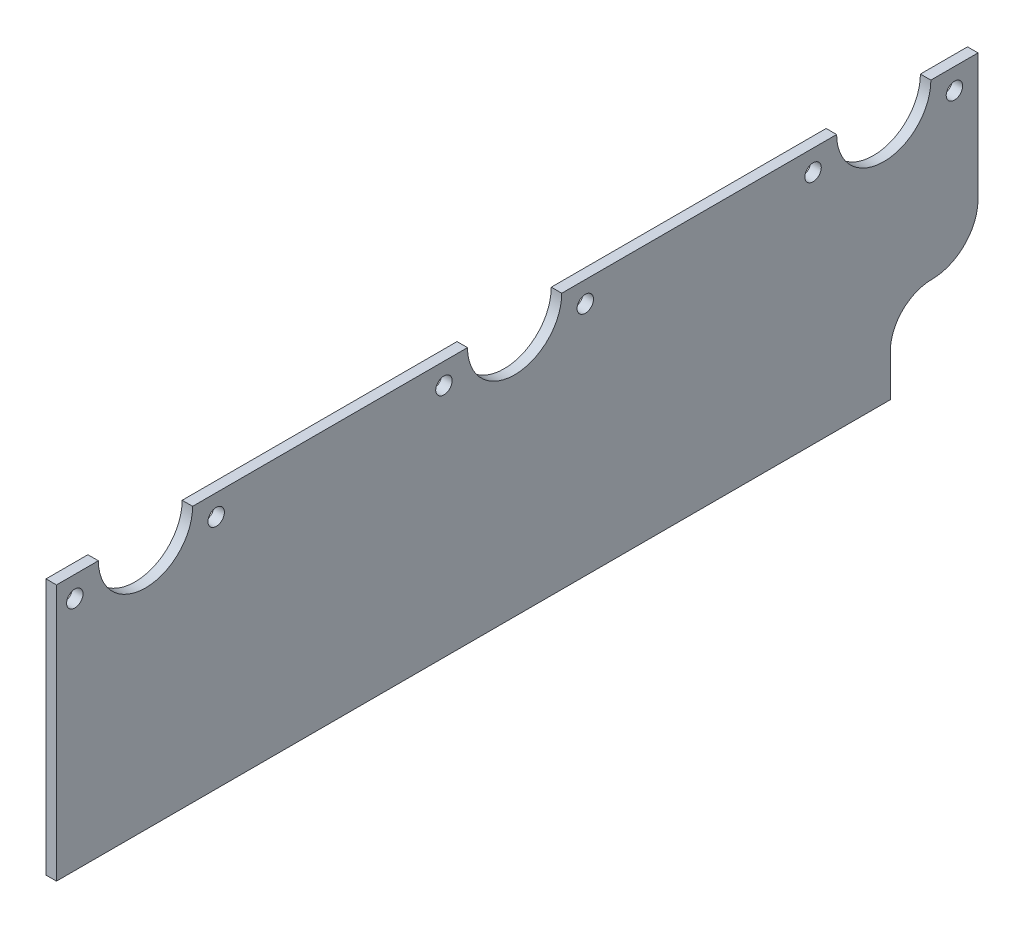
ISO-10303-21;
HEADER;
FILE_DESCRIPTION(('STEP AP214'),'2;1');
FILE_NAME('part.step','',(''),(''),'','','');
FILE_SCHEMA(('AUTOMOTIVE_DESIGN { 1 0 10303 214 1 1 1 1 }'));
ENDSEC;
DATA;
#1=APPLICATION_CONTEXT('core data for automotive mechanical design processes');
#2=APPLICATION_PROTOCOL_DEFINITION('international standard','automotive_design',2000,#1);
#3=PRODUCT_CONTEXT('',#1,'mechanical');
#4=PRODUCT('Part','Part','',(#3));
#5=PRODUCT_RELATED_PRODUCT_CATEGORY('part','',(#4));
#6=PRODUCT_DEFINITION_FORMATION('','',#4);
#7=PRODUCT_DEFINITION_CONTEXT('part definition',#1,'design');
#8=PRODUCT_DEFINITION('design','',#6,#7);
#9=PRODUCT_DEFINITION_SHAPE('','',#8);
#10=(LENGTH_UNIT() NAMED_UNIT(*) SI_UNIT(.MILLI.,.METRE.));
#11=(NAMED_UNIT(*) PLANE_ANGLE_UNIT() SI_UNIT($,.RADIAN.));
#12=(NAMED_UNIT(*) SI_UNIT($,.STERADIAN.) SOLID_ANGLE_UNIT());
#13=UNCERTAINTY_MEASURE_WITH_UNIT(LENGTH_MEASURE(1.E-05),#10,'distance_accuracy_value','');
#14=(GEOMETRIC_REPRESENTATION_CONTEXT(3) GLOBAL_UNCERTAINTY_ASSIGNED_CONTEXT((#13)) GLOBAL_UNIT_ASSIGNED_CONTEXT((#10,
#11,#12)) REPRESENTATION_CONTEXT('',''));
#15=CARTESIAN_POINT('',(0.,0.,0.));
#16=DIRECTION('',(0.,0.,1.));
#17=DIRECTION('',(1.,0.,0.));
#18=AXIS2_PLACEMENT_3D('',#15,#16,#17);
#19=CARTESIAN_POINT('',(3.175,0.,139.7));
#20=DIRECTION('',(0.,0.,-1.));
#21=DIRECTION('',(-1.,0.,0.));
#22=AXIS2_PLACEMENT_3D('',#19,#20,#21);
#23=PLANE('',#22);
#24=DIRECTION('',(0.,-1.,0.));
#25=VECTOR('',#24,1.);
#26=CARTESIAN_POINT('',(0.,0.,139.7));
#27=LINE('',#26,#25);
#28=CARTESIAN_POINT('',(0.,77.7875,139.7));
#29=VERTEX_POINT('',#28);
#30=CARTESIAN_POINT('',(0.,0.,139.7));
#31=VERTEX_POINT('',#30);
#32=EDGE_CURVE('E153',#29,#31,#27,.T.);
#33=ORIENTED_EDGE('',*,*,#32,.T.);
#34=DIRECTION('',(-1.,0.,0.));
#35=VECTOR('',#34,1.);
#36=CARTESIAN_POINT('',(3.175,0.,139.7));
#37=LINE('',#36,#35);
#38=CARTESIAN_POINT('',(3.175,0.,139.7));
#39=VERTEX_POINT('',#38);
#40=EDGE_CURVE('E11',#39,#31,#37,.T.);
#41=ORIENTED_EDGE('',*,*,#40,.F.);
#42=DIRECTION('',(0.,-1.,0.));
#43=VECTOR('',#42,1.);
#44=CARTESIAN_POINT('',(3.175,0.,139.7));
#45=LINE('',#44,#43);
#46=CARTESIAN_POINT('',(3.175,77.7875,139.7));
#47=VERTEX_POINT('',#46);
#48=EDGE_CURVE('E174',#47,#39,#45,.T.);
#49=ORIENTED_EDGE('',*,*,#48,.F.);
#50=DIRECTION('',(-1.,0.,0.));
#51=VECTOR('',#50,1.);
#52=CARTESIAN_POINT('',(3.175,77.7875,139.7));
#53=LINE('',#52,#51);
#54=EDGE_CURVE('E149',#47,#29,#53,.T.);
#55=ORIENTED_EDGE('',*,*,#54,.T.);
#56=EDGE_LOOP('',(#33,#41,#49,#55));
#57=FACE_BOUND('',#56,.T.);
#58=ADVANCED_FACE('F37',(#57),#23,.F.);
#59=CARTESIAN_POINT('',(3.175,0.,-139.7));
#60=DIRECTION('',(0.,1.,0.));
#61=DIRECTION('',(0.,0.,1.));
#62=AXIS2_PLACEMENT_3D('',#59,#60,#61);
#63=PLANE('',#62);
#64=DIRECTION('',(0.,0.,-1.));
#65=VECTOR('',#64,1.);
#66=CARTESIAN_POINT('',(0.,0.,-139.7));
#67=LINE('',#66,#65);
#68=CARTESIAN_POINT('',(0.,0.,-113.118899999999));
#69=VERTEX_POINT('',#68);
#70=EDGE_CURVE('E156',#31,#69,#67,.T.);
#71=ORIENTED_EDGE('',*,*,#70,.T.);
#72=DIRECTION('',(-1.,0.,0.));
#73=VECTOR('',#72,1.);
#74=CARTESIAN_POINT('',(3.175,0.,-113.118899999999));
#75=LINE('',#74,#73);
#76=CARTESIAN_POINT('',(3.175,0.,-113.118899999999));
#77=VERTEX_POINT('',#76);
#78=EDGE_CURVE('E51',#77,#69,#75,.T.);
#79=ORIENTED_EDGE('',*,*,#78,.F.);
#80=DIRECTION('',(0.,0.,-1.));
#81=VECTOR('',#80,1.);
#82=CARTESIAN_POINT('',(3.175,0.,-139.7));
#83=LINE('',#82,#81);
#84=EDGE_CURVE('E103',#39,#77,#83,.T.);
#85=ORIENTED_EDGE('',*,*,#84,.F.);
#86=ORIENTED_EDGE('',*,*,#40,.T.);
#87=EDGE_LOOP('',(#71,#79,#85,#86));
#88=FACE_BOUND('',#87,.T.);
#89=ADVANCED_FACE('F289',(#88),#63,.F.);
#90=CARTESIAN_POINT('',(3.175,77.7875,-139.7));
#91=DIRECTION('',(0.,0.,1.));
#92=DIRECTION('',(0.,-1.,0.));
#93=AXIS2_PLACEMENT_3D('',#90,#91,#92);
#94=PLANE('',#93);
#95=DIRECTION('',(0.,1.,0.));
#96=VECTOR('',#95,1.);
#97=CARTESIAN_POINT('',(3.175,77.7875,-139.7));
#98=LINE('',#97,#96);
#99=CARTESIAN_POINT('',(3.175,38.89375,-139.7));
#100=VERTEX_POINT('',#99);
#101=CARTESIAN_POINT('',(3.175,77.7875,-139.7));
#102=VERTEX_POINT('',#101);
#103=EDGE_CURVE('E217',#100,#102,#98,.T.);
#104=ORIENTED_EDGE('',*,*,#103,.F.);
#105=DIRECTION('',(-1.,0.,0.));
#106=VECTOR('',#105,1.);
#107=CARTESIAN_POINT('',(3.175,38.89375,-139.7));
#108=LINE('',#107,#106);
#109=CARTESIAN_POINT('',(0.,38.89375,-139.7));
#110=VERTEX_POINT('',#109);
#111=EDGE_CURVE('E256',#100,#110,#108,.T.);
#112=ORIENTED_EDGE('',*,*,#111,.T.);
#113=DIRECTION('',(0.,1.,0.));
#114=VECTOR('',#113,1.);
#115=CARTESIAN_POINT('',(0.,77.7875,-139.7));
#116=LINE('',#115,#114);
#117=CARTESIAN_POINT('',(0.,77.7875,-139.7));
#118=VERTEX_POINT('',#117);
#119=EDGE_CURVE('E160',#110,#118,#116,.T.);
#120=ORIENTED_EDGE('',*,*,#119,.T.);
#121=DIRECTION('',(-1.,0.,0.));
#122=VECTOR('',#121,1.);
#123=CARTESIAN_POINT('',(3.175,77.7875,-139.7));
#124=LINE('',#123,#122);
#125=EDGE_CURVE('E44',#102,#118,#124,.T.);
#126=ORIENTED_EDGE('',*,*,#125,.F.);
#127=EDGE_LOOP('',(#104,#112,#120,#126));
#128=FACE_BOUND('',#127,.T.);
#129=ADVANCED_FACE('F305',(#128),#94,.F.);
#130=CARTESIAN_POINT('',(3.175,77.7875,-125.4125));
#131=DIRECTION('',(0.,-1.,0.));
#132=DIRECTION('',(0.,0.,-1.));
#133=AXIS2_PLACEMENT_3D('',#130,#131,#132);
#134=PLANE('',#133);
#135=DIRECTION('',(0.,0.,1.));
#136=VECTOR('',#135,1.);
#137=CARTESIAN_POINT('',(0.,77.7875,-125.4125));
#138=LINE('',#137,#136);
#139=CARTESIAN_POINT('',(0.,77.7875,-125.4125));
#140=VERTEX_POINT('',#139);
#141=EDGE_CURVE('E162',#118,#140,#138,.T.);
#142=ORIENTED_EDGE('',*,*,#141,.T.);
#143=DIRECTION('',(-1.,0.,0.));
#144=VECTOR('',#143,1.);
#145=CARTESIAN_POINT('',(3.175,77.7875,-125.4125));
#146=LINE('',#145,#144);
#147=CARTESIAN_POINT('',(3.175,77.7875,-125.4125));
#148=VERTEX_POINT('',#147);
#149=EDGE_CURVE('E184',#148,#140,#146,.T.);
#150=ORIENTED_EDGE('',*,*,#149,.F.);
#151=DIRECTION('',(0.,0.,1.));
#152=VECTOR('',#151,1.);
#153=CARTESIAN_POINT('',(3.175,77.7875,-125.4125));
#154=LINE('',#153,#152);
#155=EDGE_CURVE('E193',#102,#148,#154,.T.);
#156=ORIENTED_EDGE('',*,*,#155,.F.);
#157=ORIENTED_EDGE('',*,*,#125,.T.);
#158=EDGE_LOOP('',(#142,#150,#156,#157));
#159=FACE_BOUND('',#158,.T.);
#160=ADVANCED_FACE('F191',(#159),#134,.F.);
#161=CARTESIAN_POINT('',(3.175,77.7875,-111.125));
#162=DIRECTION('',(-1.,0.,0.));
#163=DIRECTION('',(0.,0.,1.));
#164=AXIS2_PLACEMENT_3D('',#161,#162,#163);
#165=CYLINDRICAL_SURFACE('',#164,14.2875);
#166=CARTESIAN_POINT('',(0.,77.7875,-111.125));
#167=DIRECTION('',(-1.,0.,0.));
#168=DIRECTION('',(0.,0.,-1.));
#169=AXIS2_PLACEMENT_3D('',#166,#167,#168);
#170=CIRCLE('',#169,14.2875);
#171=CARTESIAN_POINT('',(0.,77.7875,-96.8375));
#172=VERTEX_POINT('',#171);
#173=EDGE_CURVE('E164',#140,#172,#170,.T.);
#174=ORIENTED_EDGE('',*,*,#173,.T.);
#175=DIRECTION('',(-1.,0.,0.));
#176=VECTOR('',#175,1.);
#177=CARTESIAN_POINT('',(3.175,77.7875,-96.8375));
#178=LINE('',#177,#176);
#179=CARTESIAN_POINT('',(3.175,77.7875,-96.8375));
#180=VERTEX_POINT('',#179);
#181=EDGE_CURVE('E181',#180,#172,#178,.T.);
#182=ORIENTED_EDGE('',*,*,#181,.F.);
#183=CARTESIAN_POINT('',(3.175,77.7875,-111.125));
#184=DIRECTION('',(-1.,0.,0.));
#185=DIRECTION('',(0.,0.,-1.));
#186=AXIS2_PLACEMENT_3D('',#183,#184,#185);
#187=CIRCLE('',#186,14.2875);
#188=EDGE_CURVE('E212',#148,#180,#187,.T.);
#189=ORIENTED_EDGE('',*,*,#188,.F.);
#190=ORIENTED_EDGE('',*,*,#149,.T.);
#191=EDGE_LOOP('',(#174,#182,#189,#190));
#192=FACE_BOUND('',#191,.T.);
#193=ADVANCED_FACE('F205',(#192),#165,.F.);
#194=CARTESIAN_POINT('',(3.175,77.7875,-13.49375));
#195=DIRECTION('',(0.,-1.,0.));
#196=DIRECTION('',(0.,0.,-1.));
#197=AXIS2_PLACEMENT_3D('',#194,#195,#196);
#198=PLANE('',#197);
#199=DIRECTION('',(0.,0.,1.));
#200=VECTOR('',#199,1.);
#201=CARTESIAN_POINT('',(0.,77.7875,-13.49375));
#202=LINE('',#201,#200);
#203=CARTESIAN_POINT('',(0.,77.7875,-13.49375));
#204=VERTEX_POINT('',#203);
#205=EDGE_CURVE('E166',#172,#204,#202,.T.);
#206=ORIENTED_EDGE('',*,*,#205,.T.);
#207=DIRECTION('',(-1.,0.,0.));
#208=VECTOR('',#207,1.);
#209=CARTESIAN_POINT('',(3.175,77.7875,-13.49375));
#210=LINE('',#209,#208);
#211=CARTESIAN_POINT('',(3.175,77.7875,-13.49375));
#212=VERTEX_POINT('',#211);
#213=EDGE_CURVE('E178',#212,#204,#210,.T.);
#214=ORIENTED_EDGE('',*,*,#213,.F.);
#215=DIRECTION('',(0.,0.,1.));
#216=VECTOR('',#215,1.);
#217=CARTESIAN_POINT('',(3.175,77.7875,-13.49375));
#218=LINE('',#217,#216);
#219=EDGE_CURVE('E211',#180,#212,#218,.T.);
#220=ORIENTED_EDGE('',*,*,#219,.F.);
#221=ORIENTED_EDGE('',*,*,#181,.T.);
#222=EDGE_LOOP('',(#206,#214,#220,#221));
#223=FACE_BOUND('',#222,.T.);
#224=ADVANCED_FACE('F209',(#223),#198,.F.);
#225=CARTESIAN_POINT('',(3.175,77.7875,0.793749999999971));
#226=DIRECTION('',(-1.,0.,0.));
#227=DIRECTION('',(0.,0.,1.));
#228=AXIS2_PLACEMENT_3D('',#225,#226,#227);
#229=CYLINDRICAL_SURFACE('',#228,14.2875);
#230=CARTESIAN_POINT('',(0.,77.7875,0.793749999999971));
#231=DIRECTION('',(-1.,0.,0.));
#232=DIRECTION('',(0.,0.,-1.));
#233=AXIS2_PLACEMENT_3D('',#230,#231,#232);
#234=CIRCLE('',#233,14.2875);
#235=CARTESIAN_POINT('',(0.,77.7875,15.08125));
#236=VERTEX_POINT('',#235);
#237=EDGE_CURVE('E168',#204,#236,#234,.T.);
#238=ORIENTED_EDGE('',*,*,#237,.T.);
#239=DIRECTION('',(-1.,0.,0.));
#240=VECTOR('',#239,1.);
#241=CARTESIAN_POINT('',(3.175,77.7875,15.08125));
#242=LINE('',#241,#240);
#243=CARTESIAN_POINT('',(3.175,77.7875,15.08125));
#244=VERTEX_POINT('',#243);
#245=EDGE_CURVE('E144',#244,#236,#242,.T.);
#246=ORIENTED_EDGE('',*,*,#245,.F.);
#247=CARTESIAN_POINT('',(3.175,77.7875,0.793749999999971));
#248=DIRECTION('',(-1.,0.,0.));
#249=DIRECTION('',(0.,0.,-1.));
#250=AXIS2_PLACEMENT_3D('',#247,#248,#249);
#251=CIRCLE('',#250,14.2875);
#252=EDGE_CURVE('E132',#212,#244,#251,.T.);
#253=ORIENTED_EDGE('',*,*,#252,.F.);
#254=ORIENTED_EDGE('',*,*,#213,.T.);
#255=EDGE_LOOP('',(#238,#246,#253,#254));
#256=FACE_BOUND('',#255,.T.);
#257=ADVANCED_FACE('F320',(#256),#229,.F.);
#258=CARTESIAN_POINT('',(3.175,77.7875,98.425));
#259=DIRECTION('',(0.,-1.,0.));
#260=DIRECTION('',(0.,0.,-1.));
#261=AXIS2_PLACEMENT_3D('',#258,#259,#260);
#262=PLANE('',#261);
#263=DIRECTION('',(0.,0.,1.));
#264=VECTOR('',#263,1.);
#265=CARTESIAN_POINT('',(0.,77.7875,98.425));
#266=LINE('',#265,#264);
#267=CARTESIAN_POINT('',(0.,77.7875,98.425));
#268=VERTEX_POINT('',#267);
#269=EDGE_CURVE('E141',#236,#268,#266,.T.);
#270=ORIENTED_EDGE('',*,*,#269,.T.);
#271=DIRECTION('',(-1.,0.,0.));
#272=VECTOR('',#271,1.);
#273=CARTESIAN_POINT('',(3.175,77.7875,98.425));
#274=LINE('',#273,#272);
#275=CARTESIAN_POINT('',(3.175,77.7875,98.425));
#276=VERTEX_POINT('',#275);
#277=EDGE_CURVE('E138',#276,#268,#274,.T.);
#278=ORIENTED_EDGE('',*,*,#277,.F.);
#279=DIRECTION('',(0.,0.,1.));
#280=VECTOR('',#279,1.);
#281=CARTESIAN_POINT('',(3.175,77.7875,98.425));
#282=LINE('',#281,#280);
#283=EDGE_CURVE('E123',#244,#276,#282,.T.);
#284=ORIENTED_EDGE('',*,*,#283,.F.);
#285=ORIENTED_EDGE('',*,*,#245,.T.);
#286=EDGE_LOOP('',(#270,#278,#284,#285));
#287=FACE_BOUND('',#286,.T.);
#288=ADVANCED_FACE('F139',(#287),#262,.F.);
#289=CARTESIAN_POINT('',(3.175,77.7875,112.7125));
#290=DIRECTION('',(-1.,0.,0.));
#291=DIRECTION('',(0.,0.,1.));
#292=AXIS2_PLACEMENT_3D('',#289,#290,#291);
#293=CYLINDRICAL_SURFACE('',#292,14.2875);
#294=CARTESIAN_POINT('',(0.,77.7875,112.7125));
#295=DIRECTION('',(-1.,0.,0.));
#296=DIRECTION('',(0.,0.,-1.));
#297=AXIS2_PLACEMENT_3D('',#294,#295,#296);
#298=CIRCLE('',#297,14.2875);
#299=CARTESIAN_POINT('',(0.,77.7875,127.));
#300=VERTEX_POINT('',#299);
#301=EDGE_CURVE('E171',#268,#300,#298,.T.);
#302=ORIENTED_EDGE('',*,*,#301,.T.);
#303=DIRECTION('',(-1.,0.,0.));
#304=VECTOR('',#303,1.);
#305=CARTESIAN_POINT('',(3.175,77.7875,127.));
#306=LINE('',#305,#304);
#307=CARTESIAN_POINT('',(3.175,77.7875,127.));
#308=VERTEX_POINT('',#307);
#309=EDGE_CURVE('E145',#308,#300,#306,.T.);
#310=ORIENTED_EDGE('',*,*,#309,.F.);
#311=CARTESIAN_POINT('',(3.175,77.7875,112.7125));
#312=DIRECTION('',(-1.,0.,0.));
#313=DIRECTION('',(0.,0.,-1.));
#314=AXIS2_PLACEMENT_3D('',#311,#312,#313);
#315=CIRCLE('',#314,14.2875);
#316=EDGE_CURVE('E129',#276,#308,#315,.T.);
#317=ORIENTED_EDGE('',*,*,#316,.F.);
#318=ORIENTED_EDGE('',*,*,#277,.T.);
#319=EDGE_LOOP('',(#302,#310,#317,#318));
#320=FACE_BOUND('',#319,.T.);
#321=ADVANCED_FACE('F147',(#320),#293,.F.);
#322=CARTESIAN_POINT('',(3.175,77.7875,139.7));
#323=DIRECTION('',(0.,-1.,0.));
#324=DIRECTION('',(0.,0.,-1.));
#325=AXIS2_PLACEMENT_3D('',#322,#323,#324);
#326=PLANE('',#325);
#327=DIRECTION('',(0.,0.,1.));
#328=VECTOR('',#327,1.);
#329=CARTESIAN_POINT('',(0.,77.7875,139.7));
#330=LINE('',#329,#328);
#331=EDGE_CURVE('E96',#300,#29,#330,.T.);
#332=ORIENTED_EDGE('',*,*,#331,.T.);
#333=ORIENTED_EDGE('',*,*,#54,.F.);
#334=DIRECTION('',(0.,0.,1.));
#335=VECTOR('',#334,1.);
#336=CARTESIAN_POINT('',(3.175,77.7875,139.7));
#337=LINE('',#336,#335);
#338=EDGE_CURVE('E60',#308,#47,#337,.T.);
#339=ORIENTED_EDGE('',*,*,#338,.F.);
#340=ORIENTED_EDGE('',*,*,#309,.T.);
#341=EDGE_LOOP('',(#332,#333,#339,#340));
#342=FACE_BOUND('',#341,.T.);
#343=ADVANCED_FACE('F318',(#342),#326,.F.);
#344=CARTESIAN_POINT('',(3.175,77.7875,112.7125));
#345=DIRECTION('',(1.,0.,0.));
#346=DIRECTION('',(0.,0.,-1.));
#347=AXIS2_PLACEMENT_3D('',#344,#345,#346);
#348=PLANE('',#347);
#349=CARTESIAN_POINT('',(3.175,39.3011242965767,-125.715904373387));
#350=DIRECTION('',(1.,0.,0.));
#351=DIRECTION('',(0.,0.,-1.));
#352=AXIS2_PLACEMENT_3D('',#349,#350,#351);
#353=CIRCLE('',#352,13.9900280311289);
#354=CARTESIAN_POINT('',(3.175,25.3110982295192,-125.72331752561));
#355=VERTEX_POINT('',#354);
#356=EDGE_CURVE('E259',#355,#100,#353,.T.);
#357=ORIENTED_EDGE('',*,*,#356,.T.);
#358=ORIENTED_EDGE('',*,*,#103,.T.);
#359=ORIENTED_EDGE('',*,*,#155,.T.);
#360=ORIENTED_EDGE('',*,*,#188,.T.);
#361=ORIENTED_EDGE('',*,*,#219,.T.);
#362=ORIENTED_EDGE('',*,*,#252,.T.);
#363=ORIENTED_EDGE('',*,*,#283,.T.);
#364=ORIENTED_EDGE('',*,*,#316,.T.);
#365=ORIENTED_EDGE('',*,*,#338,.T.);
#366=ORIENTED_EDGE('',*,*,#48,.T.);
#367=ORIENTED_EDGE('',*,*,#84,.T.);
#368=DIRECTION('',(0.,1.,0.));
#369=VECTOR('',#368,1.);
#370=CARTESIAN_POINT('',(3.175,12.7000000000018,-113.118899999999));
#371=LINE('',#370,#369);
#372=CARTESIAN_POINT('',(3.175,12.7000000000018,-113.118899999998));
#373=VERTEX_POINT('',#372);
#374=EDGE_CURVE('E270',#77,#373,#371,.T.);
#375=ORIENTED_EDGE('',*,*,#374,.T.);
#376=CARTESIAN_POINT('',(3.175,12.7,-125.729999999999));
#377=DIRECTION('',(-1.,0.,0.));
#378=DIRECTION('',(0.,0.,1.));
#379=AXIS2_PLACEMENT_3D('',#376,#377,#378);
#380=CIRCLE('',#379,12.6111000000008);
#381=EDGE_CURVE('E277',#373,#355,#380,.T.);
#382=ORIENTED_EDGE('',*,*,#381,.T.);
#383=EDGE_LOOP('',(#357,#358,#359,#360,#361,#362,#363,#364,#365,#366,#367,#375,#382));
#384=FACE_BOUND('',#383,.T.);
#385=CARTESIAN_POINT('',(3.175,71.4375,134.14375));
#386=DIRECTION('',(1.,0.,0.));
#387=DIRECTION('',(0.,0.,-1.));
#388=AXIS2_PLACEMENT_3D('',#385,#386,#387);
#389=CIRCLE('',#388,2.4892);
#390=CARTESIAN_POINT('',(3.175,71.4375,131.65455));
#391=VERTEX_POINT('',#390);
#392=EDGE_CURVE('E253',#391,#391,#389,.T.);
#393=ORIENTED_EDGE('',*,*,#392,.F.);
#394=EDGE_LOOP('',(#393));
#395=FACE_BOUND('',#394,.T.);
#396=CARTESIAN_POINT('',(3.175,71.4375,91.28125));
#397=DIRECTION('',(1.,0.,0.));
#398=DIRECTION('',(0.,0.,-1.));
#399=AXIS2_PLACEMENT_3D('',#396,#397,#398);
#400=CIRCLE('',#399,2.4892);
#401=CARTESIAN_POINT('',(3.175,71.4375,88.79205));
#402=VERTEX_POINT('',#401);
#403=EDGE_CURVE('E247',#402,#402,#400,.T.);
#404=ORIENTED_EDGE('',*,*,#403,.F.);
#405=EDGE_LOOP('',(#404));
#406=FACE_BOUND('',#405,.T.);
#407=CARTESIAN_POINT('',(3.175,71.4375,22.225));
#408=DIRECTION('',(1.,0.,0.));
#409=DIRECTION('',(0.,0.,-1.));
#410=AXIS2_PLACEMENT_3D('',#407,#408,#409);
#411=CIRCLE('',#410,2.4892);
#412=CARTESIAN_POINT('',(3.175,71.4375,19.7358));
#413=VERTEX_POINT('',#412);
#414=EDGE_CURVE('E241',#413,#413,#411,.T.);
#415=ORIENTED_EDGE('',*,*,#414,.F.);
#416=EDGE_LOOP('',(#415));
#417=FACE_BOUND('',#416,.T.);
#418=CARTESIAN_POINT('',(3.175,71.4375,-20.6375));
#419=DIRECTION('',(1.,0.,0.));
#420=DIRECTION('',(0.,0.,-1.));
#421=AXIS2_PLACEMENT_3D('',#418,#419,#420);
#422=CIRCLE('',#421,2.4892);
#423=CARTESIAN_POINT('',(3.175,71.4375,-23.1267));
#424=VERTEX_POINT('',#423);
#425=EDGE_CURVE('E235',#424,#424,#422,.T.);
#426=ORIENTED_EDGE('',*,*,#425,.F.);
#427=EDGE_LOOP('',(#426));
#428=FACE_BOUND('',#427,.T.);
#429=CARTESIAN_POINT('',(3.175,71.4375,-89.69375));
#430=DIRECTION('',(1.,0.,0.));
#431=DIRECTION('',(0.,0.,-1.));
#432=AXIS2_PLACEMENT_3D('',#429,#430,#431);
#433=CIRCLE('',#432,2.4892);
#434=CARTESIAN_POINT('',(3.175,71.4375,-92.18295));
#435=VERTEX_POINT('',#434);
#436=EDGE_CURVE('E229',#435,#435,#433,.T.);
#437=ORIENTED_EDGE('',*,*,#436,.F.);
#438=EDGE_LOOP('',(#437));
#439=FACE_BOUND('',#438,.T.);
#440=CARTESIAN_POINT('',(3.175,71.4375,-132.55625));
#441=DIRECTION('',(1.,0.,0.));
#442=DIRECTION('',(0.,0.,-1.));
#443=AXIS2_PLACEMENT_3D('',#440,#441,#442);
#444=CIRCLE('',#443,2.4892);
#445=CARTESIAN_POINT('',(3.175,71.4375,-135.04545));
#446=VERTEX_POINT('',#445);
#447=EDGE_CURVE('E223',#446,#446,#444,.T.);
#448=ORIENTED_EDGE('',*,*,#447,.F.);
#449=EDGE_LOOP('',(#448));
#450=FACE_BOUND('',#449,.T.);
#451=ADVANCED_FACE('F126',(#384,#395,#406,#417,#428,#439,#450),#348,.T.);
#452=CARTESIAN_POINT('',(0.,77.7875,112.7125));
#453=DIRECTION('',(1.,0.,0.));
#454=DIRECTION('',(0.,0.,-1.));
#455=AXIS2_PLACEMENT_3D('',#452,#453,#454);
#456=PLANE('',#455);
#457=CARTESIAN_POINT('',(0.,71.4375,134.14375));
#458=DIRECTION('',(1.,0.,0.));
#459=DIRECTION('',(0.,0.,-1.));
#460=AXIS2_PLACEMENT_3D('',#457,#458,#459);
#461=CIRCLE('',#460,2.4892);
#462=CARTESIAN_POINT('',(0.,71.4375,131.65455));
#463=VERTEX_POINT('',#462);
#464=EDGE_CURVE('E250',#463,#463,#461,.T.);
#465=ORIENTED_EDGE('',*,*,#464,.T.);
#466=EDGE_LOOP('',(#465));
#467=FACE_BOUND('',#466,.T.);
#468=CARTESIAN_POINT('',(0.,71.4375,91.28125));
#469=DIRECTION('',(1.,0.,0.));
#470=DIRECTION('',(0.,0.,-1.));
#471=AXIS2_PLACEMENT_3D('',#468,#469,#470);
#472=CIRCLE('',#471,2.4892);
#473=CARTESIAN_POINT('',(0.,71.4375,88.79205));
#474=VERTEX_POINT('',#473);
#475=EDGE_CURVE('E244',#474,#474,#472,.T.);
#476=ORIENTED_EDGE('',*,*,#475,.T.);
#477=EDGE_LOOP('',(#476));
#478=FACE_BOUND('',#477,.T.);
#479=CARTESIAN_POINT('',(0.,71.4375,22.225));
#480=DIRECTION('',(1.,0.,0.));
#481=DIRECTION('',(0.,0.,-1.));
#482=AXIS2_PLACEMENT_3D('',#479,#480,#481);
#483=CIRCLE('',#482,2.4892);
#484=CARTESIAN_POINT('',(0.,71.4375,19.7358));
#485=VERTEX_POINT('',#484);
#486=EDGE_CURVE('E238',#485,#485,#483,.T.);
#487=ORIENTED_EDGE('',*,*,#486,.T.);
#488=EDGE_LOOP('',(#487));
#489=FACE_BOUND('',#488,.T.);
#490=CARTESIAN_POINT('',(0.,71.4375,-20.6375));
#491=DIRECTION('',(1.,0.,0.));
#492=DIRECTION('',(0.,0.,-1.));
#493=AXIS2_PLACEMENT_3D('',#490,#491,#492);
#494=CIRCLE('',#493,2.4892);
#495=CARTESIAN_POINT('',(0.,71.4375,-23.1267));
#496=VERTEX_POINT('',#495);
#497=EDGE_CURVE('E232',#496,#496,#494,.T.);
#498=ORIENTED_EDGE('',*,*,#497,.T.);
#499=EDGE_LOOP('',(#498));
#500=FACE_BOUND('',#499,.T.);
#501=CARTESIAN_POINT('',(0.,71.4375,-89.69375));
#502=DIRECTION('',(1.,0.,0.));
#503=DIRECTION('',(0.,0.,-1.));
#504=AXIS2_PLACEMENT_3D('',#501,#502,#503);
#505=CIRCLE('',#504,2.4892);
#506=CARTESIAN_POINT('',(0.,71.4375,-92.18295));
#507=VERTEX_POINT('',#506);
#508=EDGE_CURVE('E226',#507,#507,#505,.T.);
#509=ORIENTED_EDGE('',*,*,#508,.T.);
#510=EDGE_LOOP('',(#509));
#511=FACE_BOUND('',#510,.T.);
#512=CARTESIAN_POINT('',(0.,71.4375,-132.55625));
#513=DIRECTION('',(1.,0.,0.));
#514=DIRECTION('',(0.,0.,-1.));
#515=AXIS2_PLACEMENT_3D('',#512,#513,#514);
#516=CIRCLE('',#515,2.4892);
#517=CARTESIAN_POINT('',(0.,71.4375,-135.04545));
#518=VERTEX_POINT('',#517);
#519=EDGE_CURVE('E157',#518,#518,#516,.T.);
#520=ORIENTED_EDGE('',*,*,#519,.T.);
#521=EDGE_LOOP('',(#520));
#522=FACE_BOUND('',#521,.T.);
#523=ORIENTED_EDGE('',*,*,#119,.F.);
#524=CARTESIAN_POINT('',(0.,39.3011242965767,-125.715904373387));
#525=DIRECTION('',(1.,0.,0.));
#526=DIRECTION('',(0.,0.,-1.));
#527=AXIS2_PLACEMENT_3D('',#524,#525,#526);
#528=CIRCLE('',#527,13.9900280311289);
#529=CARTESIAN_POINT('',(0.,25.3110982295192,-125.72331752561));
#530=VERTEX_POINT('',#529);
#531=EDGE_CURVE('E267',#530,#110,#528,.T.);
#532=ORIENTED_EDGE('',*,*,#531,.F.);
#533=CARTESIAN_POINT('',(0.,12.7,-125.729999999999));
#534=DIRECTION('',(-1.,0.,0.));
#535=DIRECTION('',(0.,0.,1.));
#536=AXIS2_PLACEMENT_3D('',#533,#534,#535);
#537=CIRCLE('',#536,12.6111000000008);
#538=CARTESIAN_POINT('',(0.,12.7000000000018,-113.118899999998));
#539=VERTEX_POINT('',#538);
#540=EDGE_CURVE('E271',#539,#530,#537,.T.);
#541=ORIENTED_EDGE('',*,*,#540,.F.);
#542=DIRECTION('',(0.,1.,0.));
#543=VECTOR('',#542,1.);
#544=CARTESIAN_POINT('',(0.,12.7000000000018,-113.118899999999));
#545=LINE('',#544,#543);
#546=EDGE_CURVE('E274',#69,#539,#545,.T.);
#547=ORIENTED_EDGE('',*,*,#546,.F.);
#548=ORIENTED_EDGE('',*,*,#70,.F.);
#549=ORIENTED_EDGE('',*,*,#32,.F.);
#550=ORIENTED_EDGE('',*,*,#331,.F.);
#551=ORIENTED_EDGE('',*,*,#301,.F.);
#552=ORIENTED_EDGE('',*,*,#269,.F.);
#553=ORIENTED_EDGE('',*,*,#237,.F.);
#554=ORIENTED_EDGE('',*,*,#205,.F.);
#555=ORIENTED_EDGE('',*,*,#173,.F.);
#556=ORIENTED_EDGE('',*,*,#141,.F.);
#557=EDGE_LOOP('',(#523,#532,#541,#547,#548,#549,#550,#551,#552,#553,#554,#555,#556));
#558=FACE_BOUND('',#557,.T.);
#559=ADVANCED_FACE('F199',(#467,#478,#489,#500,#511,#522,#558),#456,.F.);
#560=CARTESIAN_POINT('',(3.175,71.4375,-132.55625));
#561=DIRECTION('',(1.,0.,0.));
#562=DIRECTION('',(0.,0.,-1.));
#563=AXIS2_PLACEMENT_3D('',#560,#561,#562);
#564=CYLINDRICAL_SURFACE('',#563,2.4892);
#565=ORIENTED_EDGE('',*,*,#519,.F.);
#566=EDGE_LOOP('',(#565));
#567=FACE_BOUND('',#566,.T.);
#568=ORIENTED_EDGE('',*,*,#447,.T.);
#569=EDGE_LOOP('',(#568));
#570=FACE_BOUND('',#569,.T.);
#571=ADVANCED_FACE('F377',(#567,#570),#564,.F.);
#572=CARTESIAN_POINT('',(3.175,71.4375,-89.69375));
#573=DIRECTION('',(1.,0.,0.));
#574=DIRECTION('',(0.,0.,-1.));
#575=AXIS2_PLACEMENT_3D('',#572,#573,#574);
#576=CYLINDRICAL_SURFACE('',#575,2.4892);
#577=ORIENTED_EDGE('',*,*,#508,.F.);
#578=EDGE_LOOP('',(#577));
#579=FACE_BOUND('',#578,.T.);
#580=ORIENTED_EDGE('',*,*,#436,.T.);
#581=EDGE_LOOP('',(#580));
#582=FACE_BOUND('',#581,.T.);
#583=ADVANCED_FACE('F382',(#579,#582),#576,.F.);
#584=CARTESIAN_POINT('',(3.175,71.4375,-20.6375));
#585=DIRECTION('',(1.,0.,0.));
#586=DIRECTION('',(0.,0.,-1.));
#587=AXIS2_PLACEMENT_3D('',#584,#585,#586);
#588=CYLINDRICAL_SURFACE('',#587,2.4892);
#589=ORIENTED_EDGE('',*,*,#497,.F.);
#590=EDGE_LOOP('',(#589));
#591=FACE_BOUND('',#590,.T.);
#592=ORIENTED_EDGE('',*,*,#425,.T.);
#593=EDGE_LOOP('',(#592));
#594=FACE_BOUND('',#593,.T.);
#595=ADVANCED_FACE('F395',(#591,#594),#588,.F.);
#596=CARTESIAN_POINT('',(3.175,71.4375,22.225));
#597=DIRECTION('',(1.,0.,0.));
#598=DIRECTION('',(0.,0.,-1.));
#599=AXIS2_PLACEMENT_3D('',#596,#597,#598);
#600=CYLINDRICAL_SURFACE('',#599,2.4892);
#601=ORIENTED_EDGE('',*,*,#486,.F.);
#602=EDGE_LOOP('',(#601));
#603=FACE_BOUND('',#602,.T.);
#604=ORIENTED_EDGE('',*,*,#414,.T.);
#605=EDGE_LOOP('',(#604));
#606=FACE_BOUND('',#605,.T.);
#607=ADVANCED_FACE('F406',(#603,#606),#600,.F.);
#608=CARTESIAN_POINT('',(3.175,71.4375,91.28125));
#609=DIRECTION('',(1.,0.,0.));
#610=DIRECTION('',(0.,0.,-1.));
#611=AXIS2_PLACEMENT_3D('',#608,#609,#610);
#612=CYLINDRICAL_SURFACE('',#611,2.4892);
#613=ORIENTED_EDGE('',*,*,#475,.F.);
#614=EDGE_LOOP('',(#613));
#615=FACE_BOUND('',#614,.T.);
#616=ORIENTED_EDGE('',*,*,#403,.T.);
#617=EDGE_LOOP('',(#616));
#618=FACE_BOUND('',#617,.T.);
#619=ADVANCED_FACE('F417',(#615,#618),#612,.F.);
#620=CARTESIAN_POINT('',(3.175,71.4375,134.14375));
#621=DIRECTION('',(1.,0.,0.));
#622=DIRECTION('',(0.,0.,-1.));
#623=AXIS2_PLACEMENT_3D('',#620,#621,#622);
#624=CYLINDRICAL_SURFACE('',#623,2.4892);
#625=ORIENTED_EDGE('',*,*,#464,.F.);
#626=EDGE_LOOP('',(#625));
#627=FACE_BOUND('',#626,.T.);
#628=ORIENTED_EDGE('',*,*,#392,.T.);
#629=EDGE_LOOP('',(#628));
#630=FACE_BOUND('',#629,.T.);
#631=ADVANCED_FACE('F428',(#627,#630),#624,.F.);
#632=CARTESIAN_POINT('',(3.175,39.3011242965767,-125.715904373387));
#633=DIRECTION('',(-1.,0.,0.));
#634=DIRECTION('',(0.,0.,1.));
#635=AXIS2_PLACEMENT_3D('',#632,#633,#634);
#636=CYLINDRICAL_SURFACE('',#635,13.9900280311289);
#637=ORIENTED_EDGE('',*,*,#531,.T.);
#638=ORIENTED_EDGE('',*,*,#111,.F.);
#639=ORIENTED_EDGE('',*,*,#356,.F.);
#640=DIRECTION('',(-1.,0.,0.));
#641=VECTOR('',#640,1.);
#642=CARTESIAN_POINT('',(3.175,25.3110982295192,-125.72331752561));
#643=LINE('',#642,#641);
#644=EDGE_CURVE('E262',#355,#530,#643,.T.);
#645=ORIENTED_EDGE('',*,*,#644,.T.);
#646=EDGE_LOOP('',(#637,#638,#639,#645));
#647=FACE_BOUND('',#646,.T.);
#648=ADVANCED_FACE('F304',(#647),#636,.T.);
#649=CARTESIAN_POINT('',(3.175,12.7,-125.729999999999));
#650=DIRECTION('',(-1.,0.,0.));
#651=DIRECTION('',(0.,0.,1.));
#652=AXIS2_PLACEMENT_3D('',#649,#650,#651);
#653=CYLINDRICAL_SURFACE('',#652,12.6111000000008);
#654=ORIENTED_EDGE('',*,*,#540,.T.);
#655=ORIENTED_EDGE('',*,*,#644,.F.);
#656=ORIENTED_EDGE('',*,*,#381,.F.);
#657=DIRECTION('',(-1.,0.,0.));
#658=VECTOR('',#657,1.);
#659=CARTESIAN_POINT('',(3.175,12.7000000000018,-113.118899999998));
#660=LINE('',#659,#658);
#661=EDGE_CURVE('E258',#373,#539,#660,.T.);
#662=ORIENTED_EDGE('',*,*,#661,.T.);
#663=EDGE_LOOP('',(#654,#655,#656,#662));
#664=FACE_BOUND('',#663,.T.);
#665=ADVANCED_FACE('F302',(#664),#653,.F.);
#666=CARTESIAN_POINT('',(3.175,12.7000000000018,-113.118899999999));
#667=DIRECTION('',(0.,0.,1.));
#668=DIRECTION('',(0.,-1.,0.));
#669=AXIS2_PLACEMENT_3D('',#666,#667,#668);
#670=PLANE('',#669);
#671=ORIENTED_EDGE('',*,*,#546,.T.);
#672=ORIENTED_EDGE('',*,*,#661,.F.);
#673=ORIENTED_EDGE('',*,*,#374,.F.);
#674=ORIENTED_EDGE('',*,*,#78,.T.);
#675=EDGE_LOOP('',(#671,#672,#673,#674));
#676=FACE_BOUND('',#675,.T.);
#677=ADVANCED_FACE('F287',(#676),#670,.F.);
#678=CLOSED_SHELL('',(#58,#89,#129,#160,#193,#224,#257,#288,#321,#343,#451,#559,#571,#583,#595,
#607,#619,#631,#648,#665,#677));
#679=MANIFOLD_SOLID_BREP('B2',#678);
#680=ADVANCED_BREP_SHAPE_REPRESENTATION('',(#18,#679),#14);
#681=SHAPE_DEFINITION_REPRESENTATION(#9,#680);
ENDSEC;
END-ISO-10303-21;
